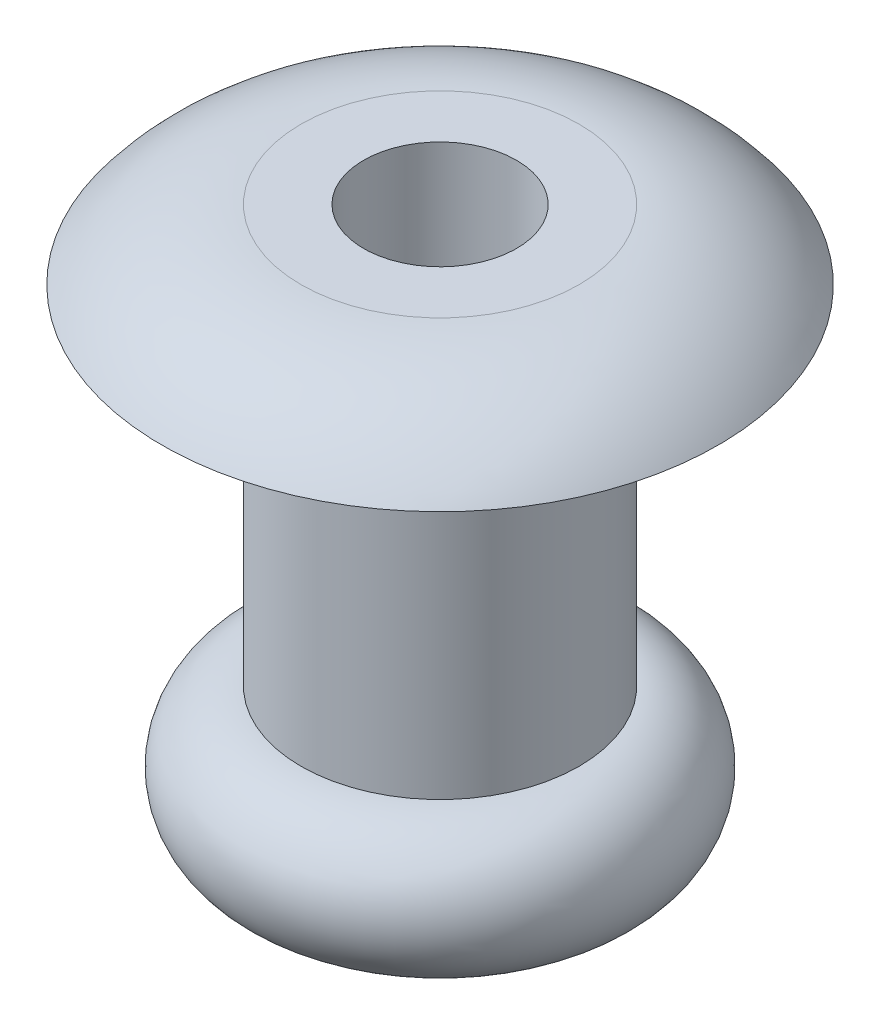
ISO-10303-21;
HEADER;
FILE_DESCRIPTION(('STEP AP214'),'2;1');
FILE_NAME('part.step','',(''),(''),'','','');
FILE_SCHEMA(('AUTOMOTIVE_DESIGN { 1 0 10303 214 1 1 1 1 }'));
ENDSEC;
DATA;
#1=APPLICATION_CONTEXT('core data for automotive mechanical design processes');
#2=APPLICATION_PROTOCOL_DEFINITION('international standard','automotive_design',2000,#1);
#3=PRODUCT_CONTEXT('',#1,'mechanical');
#4=PRODUCT('Part','Part','',(#3));
#5=PRODUCT_RELATED_PRODUCT_CATEGORY('part','',(#4));
#6=PRODUCT_DEFINITION_FORMATION('','',#4);
#7=PRODUCT_DEFINITION_CONTEXT('part definition',#1,'design');
#8=PRODUCT_DEFINITION('design','',#6,#7);
#9=PRODUCT_DEFINITION_SHAPE('','',#8);
#10=(LENGTH_UNIT() NAMED_UNIT(*) SI_UNIT(.MILLI.,.METRE.));
#11=(NAMED_UNIT(*) PLANE_ANGLE_UNIT() SI_UNIT($,.RADIAN.));
#12=(NAMED_UNIT(*) SI_UNIT($,.STERADIAN.) SOLID_ANGLE_UNIT());
#13=UNCERTAINTY_MEASURE_WITH_UNIT(LENGTH_MEASURE(1.E-05),#10,'distance_accuracy_value','');
#14=(GEOMETRIC_REPRESENTATION_CONTEXT(3) GLOBAL_UNCERTAINTY_ASSIGNED_CONTEXT((#13)) GLOBAL_UNIT_ASSIGNED_CONTEXT((#10,
#11,#12)) REPRESENTATION_CONTEXT('',''));
#15=CARTESIAN_POINT('',(0.,0.,0.));
#16=DIRECTION('',(0.,0.,1.));
#17=DIRECTION('',(1.,0.,0.));
#18=AXIS2_PLACEMENT_3D('',#15,#16,#17);
#19=CARTESIAN_POINT('',(0.,-1.5,0.));
#20=DIRECTION('',(0.,-1.,0.));
#21=DIRECTION('',(0.,0.,-1.));
#22=AXIS2_PLACEMENT_3D('',#19,#20,#21);
#23=DEGENERATE_TOROIDAL_SURFACE('',#22,2.,2.5,.T.);
#24=CARTESIAN_POINT('',(0.,0.999999999999999,0.));
#25=DIRECTION('',(0.,-1.,0.));
#26=DIRECTION('',(0.,0.,-1.));
#27=AXIS2_PLACEMENT_3D('',#24,#25,#26);
#28=CIRCLE('',#27,2.);
#29=CARTESIAN_POINT('',(0.,0.999999999999999,-2.));
#30=VERTEX_POINT('',#29);
#31=EDGE_CURVE('E64',#30,#30,#28,.T.);
#32=ORIENTED_EDGE('',*,*,#31,.T.);
#33=EDGE_LOOP('',(#32));
#34=FACE_BOUND('',#33,.T.);
#35=CARTESIAN_POINT('',(0.,0.,0.));
#36=DIRECTION('',(0.,-1.,0.));
#37=DIRECTION('',(0.,0.,-1.));
#38=AXIS2_PLACEMENT_3D('',#35,#36,#37);
#39=CIRCLE('',#38,4.);
#40=CARTESIAN_POINT('',(0.,0.,-4.));
#41=VERTEX_POINT('',#40);
#42=EDGE_CURVE('E10',#41,#41,#39,.T.);
#43=ORIENTED_EDGE('',*,*,#42,.F.);
#44=EDGE_LOOP('',(#43));
#45=FACE_BOUND('',#44,.T.);
#46=ADVANCED_FACE('F32',(#34,#45),#23,.T.);
#47=CARTESIAN_POINT('',(4.,0.,0.));
#48=DIRECTION('',(0.,-1.,0.));
#49=DIRECTION('',(0.,0.,-1.));
#50=AXIS2_PLACEMENT_3D('',#47,#48,#49);
#51=PLANE('',#50);
#52=ORIENTED_EDGE('',*,*,#42,.T.);
#53=EDGE_LOOP('',(#52));
#54=FACE_BOUND('',#53,.T.);
#55=CARTESIAN_POINT('',(0.,0.,0.));
#56=DIRECTION('',(0.,-1.,0.));
#57=DIRECTION('',(0.,0.,-1.));
#58=AXIS2_PLACEMENT_3D('',#55,#56,#57);
#59=CIRCLE('',#58,2.);
#60=CARTESIAN_POINT('',(0.,0.,-2.));
#61=VERTEX_POINT('',#60);
#62=EDGE_CURVE('E39',#61,#61,#59,.T.);
#63=ORIENTED_EDGE('',*,*,#62,.F.);
#64=EDGE_LOOP('',(#63));
#65=FACE_BOUND('',#64,.T.);
#66=ADVANCED_FACE('F83',(#54,#65),#51,.T.);
#67=CARTESIAN_POINT('',(0.,-12.8378115826995,0.));
#68=DIRECTION('',(0.,-1.,0.));
#69=DIRECTION('',(0.,0.,-1.));
#70=AXIS2_PLACEMENT_3D('',#67,#68,#69);
#71=CYLINDRICAL_SURFACE('',#70,2.);
#72=ORIENTED_EDGE('',*,*,#62,.T.);
#73=EDGE_LOOP('',(#72));
#74=FACE_BOUND('',#73,.T.);
#75=CARTESIAN_POINT('',(0.,-5.,0.));
#76=DIRECTION('',(0.,-1.,0.));
#77=DIRECTION('',(0.,0.,-1.));
#78=AXIS2_PLACEMENT_3D('',#75,#76,#77);
#79=CIRCLE('',#78,2.);
#80=CARTESIAN_POINT('',(0.,-5.,-2.));
#81=VERTEX_POINT('',#80);
#82=EDGE_CURVE('E47',#81,#81,#79,.T.);
#83=ORIENTED_EDGE('',*,*,#82,.F.);
#84=EDGE_LOOP('',(#83));
#85=FACE_BOUND('',#84,.T.);
#86=ADVANCED_FACE('F87',(#74,#85),#71,.T.);
#87=CARTESIAN_POINT('',(0.,-6.,0.));
#88=DIRECTION('',(0.,-1.,0.));
#89=DIRECTION('',(0.,0.,-1.));
#90=AXIS2_PLACEMENT_3D('',#87,#88,#89);
#91=TOROIDAL_SURFACE('',#90,2.,1.);
#92=ORIENTED_EDGE('',*,*,#82,.T.);
#93=EDGE_LOOP('',(#92));
#94=FACE_BOUND('',#93,.T.);
#95=CARTESIAN_POINT('',(0.,-7.,0.));
#96=DIRECTION('',(0.,-1.,0.));
#97=DIRECTION('',(0.,0.,-1.));
#98=AXIS2_PLACEMENT_3D('',#95,#96,#97);
#99=CIRCLE('',#98,2.);
#100=CARTESIAN_POINT('',(0.,-7.,-2.));
#101=VERTEX_POINT('',#100);
#102=EDGE_CURVE('E53',#101,#101,#99,.T.);
#103=ORIENTED_EDGE('',*,*,#102,.F.);
#104=EDGE_LOOP('',(#103));
#105=FACE_BOUND('',#104,.T.);
#106=ADVANCED_FACE('F90',(#94,#105),#91,.T.);
#107=CARTESIAN_POINT('',(2.,-7.,0.));
#108=DIRECTION('',(0.,-1.,0.));
#109=DIRECTION('',(0.,0.,-1.));
#110=AXIS2_PLACEMENT_3D('',#107,#108,#109);
#111=PLANE('',#110);
#112=ORIENTED_EDGE('',*,*,#102,.T.);
#113=EDGE_LOOP('',(#112));
#114=FACE_BOUND('',#113,.T.);
#115=CARTESIAN_POINT('',(0.,-7.,0.));
#116=DIRECTION('',(0.,-1.,0.));
#117=DIRECTION('',(0.,0.,-1.));
#118=AXIS2_PLACEMENT_3D('',#115,#116,#117);
#119=CIRCLE('',#118,1.1);
#120=CARTESIAN_POINT('',(0.,-7.,-1.1));
#121=VERTEX_POINT('',#120);
#122=EDGE_CURVE('E58',#121,#121,#119,.T.);
#123=ORIENTED_EDGE('',*,*,#122,.F.);
#124=EDGE_LOOP('',(#123));
#125=FACE_BOUND('',#124,.T.);
#126=ADVANCED_FACE('F79',(#114,#125),#111,.T.);
#127=CARTESIAN_POINT('',(0.,-12.8378115826995,0.));
#128=DIRECTION('',(0.,-1.,0.));
#129=DIRECTION('',(0.,0.,-1.));
#130=AXIS2_PLACEMENT_3D('',#127,#128,#129);
#131=CYLINDRICAL_SURFACE('',#130,1.1);
#132=ORIENTED_EDGE('',*,*,#122,.T.);
#133=EDGE_LOOP('',(#132));
#134=FACE_BOUND('',#133,.T.);
#135=CARTESIAN_POINT('',(0.,0.999999999999999,0.));
#136=DIRECTION('',(0.,-1.,0.));
#137=DIRECTION('',(0.,0.,-1.));
#138=AXIS2_PLACEMENT_3D('',#135,#136,#137);
#139=CIRCLE('',#138,1.1);
#140=CARTESIAN_POINT('',(0.,0.999999999999999,-1.1));
#141=VERTEX_POINT('',#140);
#142=EDGE_CURVE('E61',#141,#141,#139,.T.);
#143=ORIENTED_EDGE('',*,*,#142,.F.);
#144=EDGE_LOOP('',(#143));
#145=FACE_BOUND('',#144,.T.);
#146=ADVANCED_FACE('F73',(#134,#145),#131,.F.);
#147=CARTESIAN_POINT('',(1.1,1.,0.));
#148=DIRECTION('',(0.,1.,0.));
#149=DIRECTION('',(0.,0.,1.));
#150=AXIS2_PLACEMENT_3D('',#147,#148,#149);
#151=PLANE('',#150);
#152=ORIENTED_EDGE('',*,*,#142,.T.);
#153=EDGE_LOOP('',(#152));
#154=FACE_BOUND('',#153,.T.);
#155=ORIENTED_EDGE('',*,*,#31,.F.);
#156=EDGE_LOOP('',(#155));
#157=FACE_BOUND('',#156,.T.);
#158=ADVANCED_FACE('F71',(#154,#157),#151,.T.);
#159=CLOSED_SHELL('',(#46,#66,#86,#106,#126,#146,#158));
#160=MANIFOLD_SOLID_BREP('B2',#159);
#161=ADVANCED_BREP_SHAPE_REPRESENTATION('',(#18,#160),#14);
#162=SHAPE_DEFINITION_REPRESENTATION(#9,#161);
ENDSEC;
END-ISO-10303-21;
